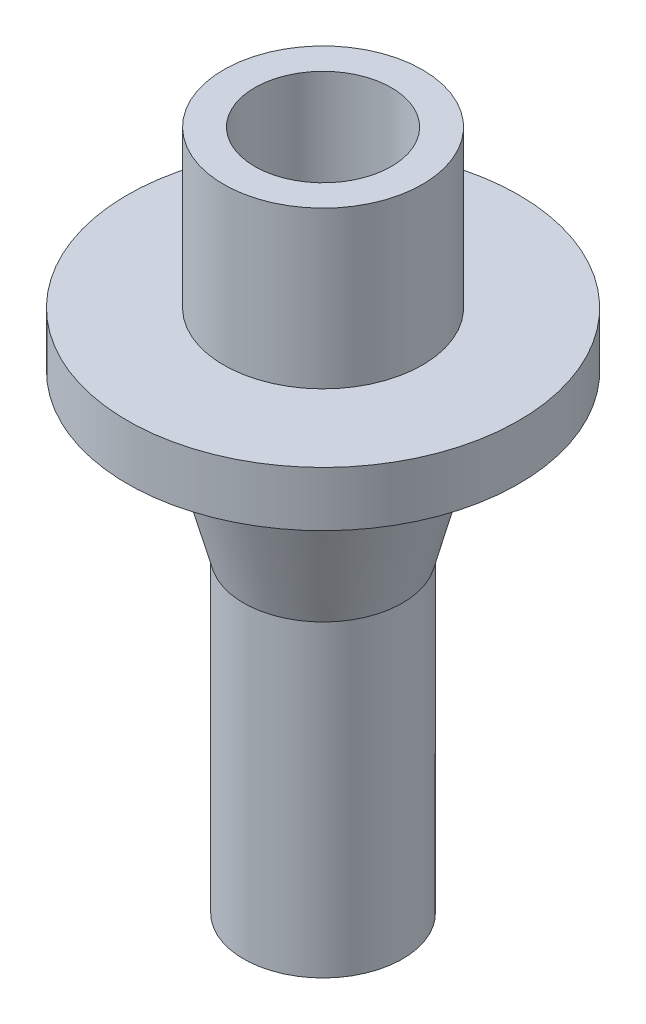
ISO-10303-21;
HEADER;
FILE_DESCRIPTION(('STEP AP214'),'2;1');
FILE_NAME('part.step','',(''),(''),'','','');
FILE_SCHEMA(('AUTOMOTIVE_DESIGN { 1 0 10303 214 1 1 1 1 }'));
ENDSEC;
DATA;
#1=APPLICATION_CONTEXT('core data for automotive mechanical design processes');
#2=APPLICATION_PROTOCOL_DEFINITION('international standard','automotive_design',2000,#1);
#3=PRODUCT_CONTEXT('',#1,'mechanical');
#4=PRODUCT('Part','Part','',(#3));
#5=PRODUCT_RELATED_PRODUCT_CATEGORY('part','',(#4));
#6=PRODUCT_DEFINITION_FORMATION('','',#4);
#7=PRODUCT_DEFINITION_CONTEXT('part definition',#1,'design');
#8=PRODUCT_DEFINITION('design','',#6,#7);
#9=PRODUCT_DEFINITION_SHAPE('','',#8);
#10=(LENGTH_UNIT() NAMED_UNIT(*) SI_UNIT(.MILLI.,.METRE.));
#11=(NAMED_UNIT(*) PLANE_ANGLE_UNIT() SI_UNIT($,.RADIAN.));
#12=(NAMED_UNIT(*) SI_UNIT($,.STERADIAN.) SOLID_ANGLE_UNIT());
#13=UNCERTAINTY_MEASURE_WITH_UNIT(LENGTH_MEASURE(1.E-05),#10,'distance_accuracy_value','');
#14=(GEOMETRIC_REPRESENTATION_CONTEXT(3) GLOBAL_UNCERTAINTY_ASSIGNED_CONTEXT((#13)) GLOBAL_UNIT_ASSIGNED_CONTEXT((#10,
#11,#12)) REPRESENTATION_CONTEXT('',''));
#15=CARTESIAN_POINT('',(0.,0.,0.));
#16=DIRECTION('',(0.,0.,1.));
#17=DIRECTION('',(1.,0.,0.));
#18=AXIS2_PLACEMENT_3D('',#15,#16,#17);
#19=CARTESIAN_POINT('',(0.,27.,0.));
#20=DIRECTION('',(0.,1.,0.));
#21=DIRECTION('',(0.,0.,1.));
#22=AXIS2_PLACEMENT_3D('',#19,#20,#21);
#23=PLANE('',#22);
#24=CARTESIAN_POINT('',(0.,27.,0.));
#25=DIRECTION('',(0.,1.,0.));
#26=DIRECTION('',(0.,0.,1.));
#27=AXIS2_PLACEMENT_3D('',#24,#25,#26);
#28=CIRCLE('',#27,8.73125);
#29=CARTESIAN_POINT('',(0.,27.,8.73125));
#30=VERTEX_POINT('',#29);
#31=EDGE_CURVE('E80',#30,#30,#28,.T.);
#32=ORIENTED_EDGE('',*,*,#31,.F.);
#33=EDGE_LOOP('',(#32));
#34=FACE_BOUND('',#33,.T.);
#35=CARTESIAN_POINT('',(0.,27.,0.));
#36=DIRECTION('',(0.,-1.,0.));
#37=DIRECTION('',(0.,0.,-1.));
#38=AXIS2_PLACEMENT_3D('',#35,#36,#37);
#39=CIRCLE('',#38,12.7);
#40=CARTESIAN_POINT('',(0.,27.,-12.7));
#41=VERTEX_POINT('',#40);
#42=EDGE_CURVE('E10',#41,#41,#39,.T.);
#43=ORIENTED_EDGE('',*,*,#42,.F.);
#44=EDGE_LOOP('',(#43));
#45=FACE_BOUND('',#44,.T.);
#46=ADVANCED_FACE('F41',(#34,#45),#23,.T.);
#47=CARTESIAN_POINT('',(0.,0.,0.));
#48=DIRECTION('',(0.,-1.,0.));
#49=DIRECTION('',(0.,0.,-1.));
#50=AXIS2_PLACEMENT_3D('',#47,#48,#49);
#51=CYLINDRICAL_SURFACE('',#50,12.7);
#52=ORIENTED_EDGE('',*,*,#42,.T.);
#53=EDGE_LOOP('',(#52));
#54=FACE_BOUND('',#53,.T.);
#55=CARTESIAN_POINT('',(0.,7.,0.));
#56=DIRECTION('',(0.,-1.,0.));
#57=DIRECTION('',(0.,0.,-1.));
#58=AXIS2_PLACEMENT_3D('',#55,#56,#57);
#59=CIRCLE('',#58,12.7);
#60=CARTESIAN_POINT('',(0.,7.,-12.7));
#61=VERTEX_POINT('',#60);
#62=EDGE_CURVE('E48',#61,#61,#59,.T.);
#63=ORIENTED_EDGE('',*,*,#62,.F.);
#64=EDGE_LOOP('',(#63));
#65=FACE_BOUND('',#64,.T.);
#66=ADVANCED_FACE('F115',(#54,#65),#51,.T.);
#67=CARTESIAN_POINT('',(0.,7.,-12.7));
#68=DIRECTION('',(0.,1.,0.));
#69=DIRECTION('',(0.,0.,1.));
#70=AXIS2_PLACEMENT_3D('',#67,#68,#69);
#71=PLANE('',#70);
#72=ORIENTED_EDGE('',*,*,#62,.T.);
#73=EDGE_LOOP('',(#72));
#74=FACE_BOUND('',#73,.T.);
#75=CARTESIAN_POINT('',(0.,7.,0.));
#76=DIRECTION('',(0.,-1.,0.));
#77=DIRECTION('',(0.,0.,-1.));
#78=AXIS2_PLACEMENT_3D('',#75,#76,#77);
#79=CIRCLE('',#78,25.);
#80=CARTESIAN_POINT('',(0.,7.,-25.));
#81=VERTEX_POINT('',#80);
#82=EDGE_CURVE('E53',#81,#81,#79,.T.);
#83=ORIENTED_EDGE('',*,*,#82,.F.);
#84=EDGE_LOOP('',(#83));
#85=FACE_BOUND('',#84,.T.);
#86=ADVANCED_FACE('F120',(#74,#85),#71,.T.);
#87=CARTESIAN_POINT('',(0.,0.,0.));
#88=DIRECTION('',(0.,-1.,0.));
#89=DIRECTION('',(0.,0.,-1.));
#90=AXIS2_PLACEMENT_3D('',#87,#88,#89);
#91=CYLINDRICAL_SURFACE('',#90,25.);
#92=ORIENTED_EDGE('',*,*,#82,.T.);
#93=EDGE_LOOP('',(#92));
#94=FACE_BOUND('',#93,.T.);
#95=CARTESIAN_POINT('',(0.,0.,0.));
#96=DIRECTION('',(0.,-1.,0.));
#97=DIRECTION('',(0.,0.,-1.));
#98=AXIS2_PLACEMENT_3D('',#95,#96,#97);
#99=CIRCLE('',#98,25.);
#100=CARTESIAN_POINT('',(0.,0.,-25.));
#101=VERTEX_POINT('',#100);
#102=EDGE_CURVE('E58',#101,#101,#99,.T.);
#103=ORIENTED_EDGE('',*,*,#102,.F.);
#104=EDGE_LOOP('',(#103));
#105=FACE_BOUND('',#104,.T.);
#106=ADVANCED_FACE('F181',(#94,#105),#91,.T.);
#107=CARTESIAN_POINT('',(0.,0.,-25.));
#108=DIRECTION('',(0.,-1.,0.));
#109=DIRECTION('',(0.,0.,-1.));
#110=AXIS2_PLACEMENT_3D('',#107,#108,#109);
#111=PLANE('',#110);
#112=ORIENTED_EDGE('',*,*,#102,.T.);
#113=EDGE_LOOP('',(#112));
#114=FACE_BOUND('',#113,.T.);
#115=CARTESIAN_POINT('',(0.,0.,0.));
#116=DIRECTION('',(0.,-1.,0.));
#117=DIRECTION('',(0.,0.,-1.));
#118=AXIS2_PLACEMENT_3D('',#115,#116,#117);
#119=CIRCLE('',#118,15.68);
#120=CARTESIAN_POINT('',(0.,0.,-15.68));
#121=VERTEX_POINT('',#120);
#122=EDGE_CURVE('E64',#121,#121,#119,.T.);
#123=ORIENTED_EDGE('',*,*,#122,.F.);
#124=EDGE_LOOP('',(#123));
#125=FACE_BOUND('',#124,.T.);
#126=ADVANCED_FACE('F111',(#114,#125),#111,.T.);
#127=CARTESIAN_POINT('',(0.,-20.6009204577807,0.));
#128=DIRECTION('',(0.,1.,0.));
#129=DIRECTION('',(0.,0.,1.));
#130=AXIS2_PLACEMENT_3D('',#127,#128,#129);
#131=CONICAL_SURFACE('',#130,10.16,0.261799387799143);
#132=ORIENTED_EDGE('',*,*,#122,.T.);
#133=EDGE_LOOP('',(#132));
#134=FACE_BOUND('',#133,.T.);
#135=CARTESIAN_POINT('',(0.,-20.6009204577807,0.));
#136=DIRECTION('',(0.,-1.,0.));
#137=DIRECTION('',(0.,0.,-1.));
#138=AXIS2_PLACEMENT_3D('',#135,#136,#137);
#139=CIRCLE('',#138,10.16);
#140=CARTESIAN_POINT('',(0.,-20.6009204577807,-10.16));
#141=VERTEX_POINT('',#140);
#142=EDGE_CURVE('E68',#141,#141,#139,.T.);
#143=ORIENTED_EDGE('',*,*,#142,.F.);
#144=EDGE_LOOP('',(#143));
#145=FACE_BOUND('',#144,.T.);
#146=ADVANCED_FACE('F105',(#134,#145),#131,.T.);
#147=CARTESIAN_POINT('',(0.,0.,0.));
#148=DIRECTION('',(0.,-1.,0.));
#149=DIRECTION('',(0.,0.,-1.));
#150=AXIS2_PLACEMENT_3D('',#147,#148,#149);
#151=CYLINDRICAL_SURFACE('',#150,10.16);
#152=ORIENTED_EDGE('',*,*,#142,.T.);
#153=EDGE_LOOP('',(#152));
#154=FACE_BOUND('',#153,.T.);
#155=CARTESIAN_POINT('',(0.,-60.,0.));
#156=DIRECTION('',(0.,-1.,0.));
#157=DIRECTION('',(0.,0.,-1.));
#158=AXIS2_PLACEMENT_3D('',#155,#156,#157);
#159=CIRCLE('',#158,10.16);
#160=CARTESIAN_POINT('',(0.,-60.,-10.16));
#161=VERTEX_POINT('',#160);
#162=EDGE_CURVE('E72',#161,#161,#159,.T.);
#163=ORIENTED_EDGE('',*,*,#162,.F.);
#164=EDGE_LOOP('',(#163));
#165=FACE_BOUND('',#164,.T.);
#166=ADVANCED_FACE('F100',(#154,#165),#151,.T.);
#167=CARTESIAN_POINT('',(0.,-60.,-10.16));
#168=DIRECTION('',(0.,-1.,0.));
#169=DIRECTION('',(0.,0.,-1.));
#170=AXIS2_PLACEMENT_3D('',#167,#168,#169);
#171=PLANE('',#170);
#172=CARTESIAN_POINT('',(0.,-60.,0.));
#173=DIRECTION('',(0.,-1.,0.));
#174=DIRECTION('',(0.,0.,-1.));
#175=AXIS2_PLACEMENT_3D('',#172,#173,#174);
#176=CIRCLE('',#175,7.5);
#177=CARTESIAN_POINT('',(0.,-60.,-7.5));
#178=VERTEX_POINT('',#177);
#179=EDGE_CURVE('E88',#178,#178,#176,.T.);
#180=ORIENTED_EDGE('',*,*,#179,.F.);
#181=EDGE_LOOP('',(#180));
#182=FACE_BOUND('',#181,.T.);
#183=ORIENTED_EDGE('',*,*,#162,.T.);
#184=EDGE_LOOP('',(#183));
#185=FACE_BOUND('',#184,.T.);
#186=ADVANCED_FACE('F96',(#182,#185),#171,.T.);
#187=CARTESIAN_POINT('',(0.,7.,0.));
#188=DIRECTION('',(0.,1.,0.));
#189=DIRECTION('',(0.,0.,1.));
#190=AXIS2_PLACEMENT_3D('',#187,#188,#189);
#191=CONICAL_SURFACE('',#190,8.73124999999999,1.02974425867665);
#192=CARTESIAN_POINT('',(0.,6.26019036282232,0.));
#193=DIRECTION('',(0.,1.,0.));
#194=DIRECTION('',(0.,0.,1.));
#195=AXIS2_PLACEMENT_3D('',#192,#193,#194);
#196=CIRCLE('',#195,7.5);
#197=CARTESIAN_POINT('',(0.,6.26019036282232,-7.5));
#198=VERTEX_POINT('',#197);
#199=EDGE_CURVE('E84',#198,#198,#196,.T.);
#200=ORIENTED_EDGE('',*,*,#199,.F.);
#201=EDGE_LOOP('',(#200));
#202=FACE_BOUND('',#201,.T.);
#203=CARTESIAN_POINT('',(0.,7.,0.));
#204=DIRECTION('',(0.,1.,0.));
#205=DIRECTION('',(0.,0.,1.));
#206=AXIS2_PLACEMENT_3D('',#203,#204,#205);
#207=CIRCLE('',#206,8.73124999999999);
#208=CARTESIAN_POINT('',(0.,7.,8.73124999999999));
#209=VERTEX_POINT('',#208);
#210=EDGE_CURVE('E76',#209,#209,#207,.T.);
#211=ORIENTED_EDGE('',*,*,#210,.T.);
#212=EDGE_LOOP('',(#211));
#213=FACE_BOUND('',#212,.T.);
#214=ADVANCED_FACE('F99',(#202,#213),#191,.F.);
#215=CARTESIAN_POINT('',(0.,27.,0.));
#216=DIRECTION('',(0.,1.,0.));
#217=DIRECTION('',(0.,0.,1.));
#218=AXIS2_PLACEMENT_3D('',#215,#216,#217);
#219=CYLINDRICAL_SURFACE('',#218,8.73125);
#220=ORIENTED_EDGE('',*,*,#210,.F.);
#221=EDGE_LOOP('',(#220));
#222=FACE_BOUND('',#221,.T.);
#223=ORIENTED_EDGE('',*,*,#31,.T.);
#224=EDGE_LOOP('',(#223));
#225=FACE_BOUND('',#224,.T.);
#226=ADVANCED_FACE('F124',(#222,#225),#219,.F.);
#227=CARTESIAN_POINT('',(0.,27.001,0.));
#228=DIRECTION('',(0.,-1.,0.));
#229=DIRECTION('',(0.,0.,-1.));
#230=AXIS2_PLACEMENT_3D('',#227,#228,#229);
#231=CYLINDRICAL_SURFACE('',#230,7.5);
#232=CARTESIAN_POINT('',(0.,-60.,-7.5));
#233=CARTESIAN_POINT('',(0.,-59.3097896837206,-7.5));
#234=CARTESIAN_POINT('',(0.,-58.6195793674412,-7.5));
#235=CARTESIAN_POINT('',(0.,-57.2391587348824,-7.5));
#236=CARTESIAN_POINT('',(0.,-56.548948418603,-7.5));
#237=CARTESIAN_POINT('',(0.,-55.1685277860442,-7.5));
#238=CARTESIAN_POINT('',(0.,-54.4783174697648,-7.5));
#239=CARTESIAN_POINT('',(0.,-53.097896837206,-7.5));
#240=CARTESIAN_POINT('',(0.,-52.4076865209266,-7.5));
#241=CARTESIAN_POINT('',(0.,-51.0272658883678,-7.5));
#242=CARTESIAN_POINT('',(0.,-50.3370555720884,-7.5));
#243=CARTESIAN_POINT('',(0.,-48.9566349395296,-7.5));
#244=CARTESIAN_POINT('',(0.,-48.2664246232502,-7.5));
#245=CARTESIAN_POINT('',(0.,-46.8860039906914,-7.5));
#246=CARTESIAN_POINT('',(0.,-46.195793674412,-7.5));
#247=CARTESIAN_POINT('',(0.,-44.8153730418532,-7.5));
#248=CARTESIAN_POINT('',(0.,-44.1251627255738,-7.5));
#249=CARTESIAN_POINT('',(0.,-42.744742093015,-7.5));
#250=CARTESIAN_POINT('',(0.,-42.0545317767356,-7.5));
#251=CARTESIAN_POINT('',(0.,-40.6741111441768,-7.5));
#252=CARTESIAN_POINT('',(0.,-39.9839008278974,-7.5));
#253=CARTESIAN_POINT('',(0.,-38.6034801953386,-7.5));
#254=CARTESIAN_POINT('',(0.,-37.9132698790592,-7.5));
#255=CARTESIAN_POINT('',(0.,-36.5328492465004,-7.5));
#256=CARTESIAN_POINT('',(0.,-35.842638930221,-7.5));
#257=CARTESIAN_POINT('',(0.,-34.4622182976622,-7.5));
#258=CARTESIAN_POINT('',(0.,-33.7720079813828,-7.5));
#259=CARTESIAN_POINT('',(0.,-32.391587348824,-7.5));
#260=CARTESIAN_POINT('',(0.,-31.7013770325446,-7.5));
#261=CARTESIAN_POINT('',(0.,-30.3209563999858,-7.5));
#262=CARTESIAN_POINT('',(0.,-29.6307460837064,-7.5));
#263=CARTESIAN_POINT('',(0.,-28.2503254511476,-7.5));
#264=CARTESIAN_POINT('',(0.,-27.5601151348682,-7.5));
#265=CARTESIAN_POINT('',(0.,-26.1796945023094,-7.5));
#266=CARTESIAN_POINT('',(0.,-25.48948418603,-7.5));
#267=CARTESIAN_POINT('',(0.,-24.1090635534712,-7.5));
#268=CARTESIAN_POINT('',(0.,-23.4188532371918,-7.5));
#269=CARTESIAN_POINT('',(0.,-22.038432604633,-7.5));
#270=CARTESIAN_POINT('',(0.,-21.3482222883536,-7.5));
#271=CARTESIAN_POINT('',(0.,-19.9678016557948,-7.5));
#272=CARTESIAN_POINT('',(0.,-19.2775913395154,-7.5));
#273=CARTESIAN_POINT('',(0.,-17.8971707069566,-7.5));
#274=CARTESIAN_POINT('',(0.,-17.2069603906773,-7.5));
#275=CARTESIAN_POINT('',(0.,-15.8265397581185,-7.5));
#276=CARTESIAN_POINT('',(0.,-15.1363294418391,-7.5));
#277=CARTESIAN_POINT('',(0.,-13.7559088092803,-7.5));
#278=CARTESIAN_POINT('',(0.,-13.0656984930009,-7.5));
#279=CARTESIAN_POINT('',(0.,-11.6852778604421,-7.5));
#280=CARTESIAN_POINT('',(0.,-10.9950675441627,-7.5));
#281=CARTESIAN_POINT('',(0.,-9.61464691160386,-7.5));
#282=CARTESIAN_POINT('',(0.,-8.92443659532446,-7.5));
#283=CARTESIAN_POINT('',(0.,-7.54401596276566,-7.5));
#284=CARTESIAN_POINT('',(0.,-6.85380564648626,-7.5));
#285=CARTESIAN_POINT('',(0.,-5.47338501392746,-7.5));
#286=CARTESIAN_POINT('',(0.,-4.78317469764807,-7.5));
#287=CARTESIAN_POINT('',(0.,-3.40275406508927,-7.5));
#288=CARTESIAN_POINT('',(0.,-2.71254374880987,-7.5));
#289=CARTESIAN_POINT('',(0.,-1.33212311625107,-7.5));
#290=CARTESIAN_POINT('',(0.,-0.641912799971675,-7.5));
#291=CARTESIAN_POINT('',(0.,0.738507832587125,-7.5));
#292=CARTESIAN_POINT('',(0.,1.42871814886652,-7.5));
#293=CARTESIAN_POINT('',(0.,2.80913878142532,-7.5));
#294=CARTESIAN_POINT('',(0.,3.49934909770472,-7.5));
#295=CARTESIAN_POINT('',(0.,4.87976973026352,-7.5));
#296=CARTESIAN_POINT('',(0.,5.56998004654292,-7.5));
#297=CARTESIAN_POINT('',(0.,6.26019036282232,-7.5));
#298=B_SPLINE_CURVE_WITH_KNOTS('',3,(#232,#233,#234,#235,#236,#237,#238,#239,#240,#241,#242,
#243,#244,#245,#246,#247,#248,#249,#250,#251,#252,#253,#254,#255,#256,#257,#258,#259,#260,#261,
#262,#263,#264,#265,#266,#267,#268,#269,#270,#271,#272,#273,#274,#275,#276,#277,#278,#279,#280,
#281,#282,#283,#284,#285,#286,#287,#288,#289,#290,#291,#292,#293,#294,#295,#296,#297),
.UNSPECIFIED.,.F.,.F.,(4,2,2,2,2,2,2,2,2,2,2,2,2,2,2,2,2,2,2,2,2,2,2,2,2,2,2,2,2,2,2,2,4),(0.,
2.07063094883819,4.1412618976764,6.21189284651459,8.28252379535278,10.353154744191,
12.4237856930292,14.4944166418674,16.5650475907056,18.6356785395438,20.706309488382,
22.7769404372202,24.8475713860584,26.9182023348966,28.9888332837348,31.0594642325729,
33.1300951814111,35.2007261302494,37.2713570790875,39.3419880279257,41.4126189767639,
43.4832499256021,45.5538808744403,47.6245118232785,49.6951427721167,51.7657737209549,
53.8364046697931,55.9070356186313,57.9776665674695,60.0482975163077,62.1189284651459,
64.1895594139841,66.2601903628223),.UNSPECIFIED.);
#299=EDGE_CURVE('BSEAM93',#178,#198,#298,.T.);
#300=ORIENTED_EDGE('',*,*,#179,.T.);
#301=ORIENTED_EDGE('',*,*,#199,.T.);
#302=ORIENTED_EDGE('',*,*,#299,.T.);
#303=ORIENTED_EDGE('',*,*,#299,.F.);
#304=EDGE_LOOP('',(#300,#302,#301,#303));
#305=FACE_BOUND('',#304,.T.);
#306=ADVANCED_FACE('F93',(#305),#231,.F.);
#307=CLOSED_SHELL('',(#46,#66,#86,#106,#126,#146,#166,#186,#214,#226,#306));
#308=MANIFOLD_SOLID_BREP('B2',#307);
#309=ADVANCED_BREP_SHAPE_REPRESENTATION('',(#18,#308),#14);
#310=SHAPE_DEFINITION_REPRESENTATION(#9,#309);
ENDSEC;
END-ISO-10303-21;
